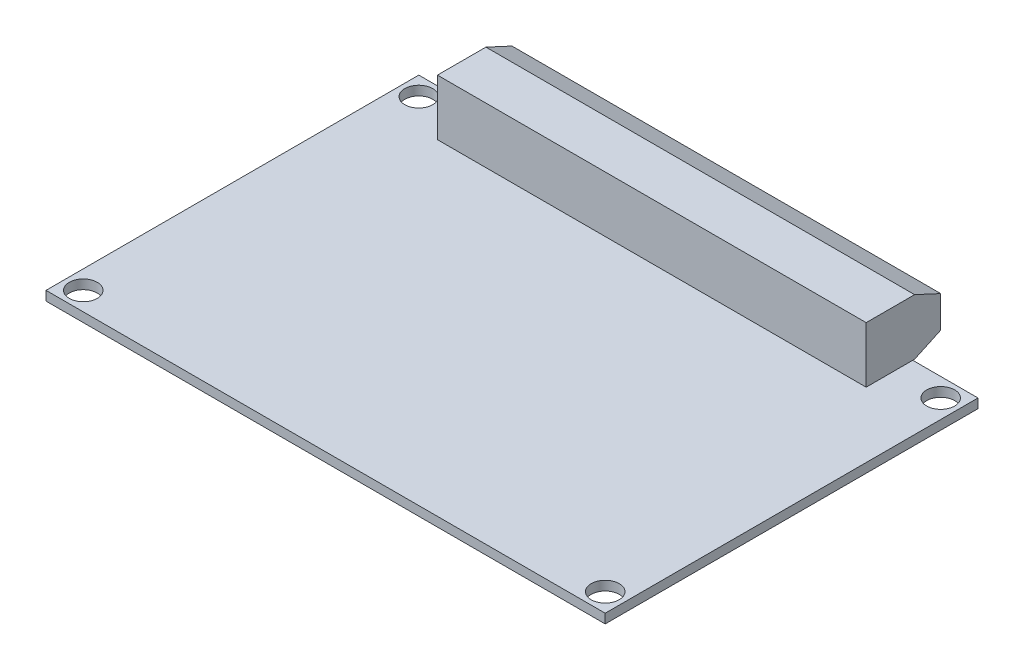
ISO-10303-21;
HEADER;
FILE_DESCRIPTION(('STEP AP214'),'2;1');
FILE_NAME('part.step','',(''),(''),'','','');
FILE_SCHEMA(('AUTOMOTIVE_DESIGN { 1 0 10303 214 1 1 1 1 }'));
ENDSEC;
DATA;
#1=APPLICATION_CONTEXT('core data for automotive mechanical design processes');
#2=APPLICATION_PROTOCOL_DEFINITION('international standard','automotive_design',2000,#1);
#3=PRODUCT_CONTEXT('',#1,'mechanical');
#4=PRODUCT('Part','Part','',(#3));
#5=PRODUCT_RELATED_PRODUCT_CATEGORY('part','',(#4));
#6=PRODUCT_DEFINITION_FORMATION('','',#4);
#7=PRODUCT_DEFINITION_CONTEXT('part definition',#1,'design');
#8=PRODUCT_DEFINITION('design','',#6,#7);
#9=PRODUCT_DEFINITION_SHAPE('','',#8);
#10=(LENGTH_UNIT() NAMED_UNIT(*) SI_UNIT(.MILLI.,.METRE.));
#11=(NAMED_UNIT(*) PLANE_ANGLE_UNIT() SI_UNIT($,.RADIAN.));
#12=(NAMED_UNIT(*) SI_UNIT($,.STERADIAN.) SOLID_ANGLE_UNIT());
#13=UNCERTAINTY_MEASURE_WITH_UNIT(LENGTH_MEASURE(1.E-05),#10,'distance_accuracy_value','');
#14=(GEOMETRIC_REPRESENTATION_CONTEXT(3) GLOBAL_UNCERTAINTY_ASSIGNED_CONTEXT((#13)) GLOBAL_UNIT_ASSIGNED_CONTEXT((#10,
#11,#12)) REPRESENTATION_CONTEXT('',''));
#15=CARTESIAN_POINT('',(0.,0.,0.));
#16=DIRECTION('',(0.,0.,1.));
#17=DIRECTION('',(1.,0.,0.));
#18=AXIS2_PLACEMENT_3D('',#15,#16,#17);
#19=CARTESIAN_POINT('',(0.,0.5,0.));
#20=DIRECTION('',(0.,-1.,0.));
#21=DIRECTION('',(0.,0.,-1.));
#22=AXIS2_PLACEMENT_3D('',#19,#20,#21);
#23=PLANE('',#22);
#24=CARTESIAN_POINT('',(-28.,0.500000000000007,-18.));
#25=DIRECTION('',(0.,1.,0.));
#26=DIRECTION('',(0.,0.,1.));
#27=AXIS2_PLACEMENT_3D('',#24,#25,#26);
#28=CIRCLE('',#27,1.5);
#29=CARTESIAN_POINT('',(-28.,0.500000000000007,-16.5));
#30=VERTEX_POINT('',#29);
#31=EDGE_CURVE('E149',#30,#30,#28,.T.);
#32=ORIENTED_EDGE('',*,*,#31,.F.);
#33=EDGE_LOOP('',(#32));
#34=FACE_BOUND('',#33,.T.);
#35=CARTESIAN_POINT('',(-28.,0.500000000000007,18.));
#36=DIRECTION('',(0.,1.,0.));
#37=DIRECTION('',(0.,0.,-1.));
#38=AXIS2_PLACEMENT_3D('',#35,#36,#37);
#39=CIRCLE('',#38,1.5);
#40=CARTESIAN_POINT('',(-28.,0.500000000000007,16.5));
#41=VERTEX_POINT('',#40);
#42=EDGE_CURVE('E145',#41,#41,#39,.T.);
#43=ORIENTED_EDGE('',*,*,#42,.F.);
#44=EDGE_LOOP('',(#43));
#45=FACE_BOUND('',#44,.T.);
#46=CARTESIAN_POINT('',(28.,0.5,17.9999999999999));
#47=DIRECTION('',(0.,1.,0.));
#48=DIRECTION('',(0.,0.,1.));
#49=AXIS2_PLACEMENT_3D('',#46,#47,#48);
#50=CIRCLE('',#49,1.5);
#51=CARTESIAN_POINT('',(28.,0.5,19.4999999999999));
#52=VERTEX_POINT('',#51);
#53=EDGE_CURVE('E156',#52,#52,#50,.T.);
#54=ORIENTED_EDGE('',*,*,#53,.F.);
#55=EDGE_LOOP('',(#54));
#56=FACE_BOUND('',#55,.T.);
#57=CARTESIAN_POINT('',(28.,0.5,-18.));
#58=DIRECTION('',(0.,1.,0.));
#59=DIRECTION('',(0.,0.,-1.));
#60=AXIS2_PLACEMENT_3D('',#57,#58,#59);
#61=CIRCLE('',#60,1.5);
#62=CARTESIAN_POINT('',(28.,0.5,-19.5));
#63=VERTEX_POINT('',#62);
#64=EDGE_CURVE('E150',#63,#63,#61,.T.);
#65=ORIENTED_EDGE('',*,*,#64,.F.);
#66=EDGE_LOOP('',(#65));
#67=FACE_BOUND('',#66,.T.);
#68=DIRECTION('',(0.,0.,1.));
#69=VECTOR('',#68,1.);
#70=CARTESIAN_POINT('',(-23.,0.5,-23.));
#71=LINE('',#70,#69);
#72=CARTESIAN_POINT('',(-23.,0.5,-20.));
#73=VERTEX_POINT('',#72);
#74=CARTESIAN_POINT('',(-23.,0.5,-15.));
#75=VERTEX_POINT('',#74);
#76=EDGE_CURVE('E201',#73,#75,#71,.T.);
#77=ORIENTED_EDGE('',*,*,#76,.F.);
#78=DIRECTION('',(-1.,0.,0.));
#79=VECTOR('',#78,1.);
#80=CARTESIAN_POINT('',(-30.,0.5,-20.));
#81=LINE('',#80,#79);
#82=CARTESIAN_POINT('',(-30.,0.5,-20.));
#83=VERTEX_POINT('',#82);
#84=EDGE_CURVE('E173',#73,#83,#81,.T.);
#85=ORIENTED_EDGE('',*,*,#84,.T.);
#86=DIRECTION('',(0.,0.,1.));
#87=VECTOR('',#86,1.);
#88=CARTESIAN_POINT('',(-30.,0.5,20.));
#89=LINE('',#88,#87);
#90=CARTESIAN_POINT('',(-30.,0.5,20.));
#91=VERTEX_POINT('',#90);
#92=EDGE_CURVE('E178',#83,#91,#89,.T.);
#93=ORIENTED_EDGE('',*,*,#92,.T.);
#94=DIRECTION('',(1.,0.,0.));
#95=VECTOR('',#94,1.);
#96=CARTESIAN_POINT('',(-30.,0.5,20.));
#97=LINE('',#96,#95);
#98=CARTESIAN_POINT('',(30.,0.499999999999994,19.9999999999999));
#99=VERTEX_POINT('',#98);
#100=EDGE_CURVE('E181',#91,#99,#97,.T.);
#101=ORIENTED_EDGE('',*,*,#100,.T.);
#102=DIRECTION('',(0.,0.,-1.));
#103=VECTOR('',#102,1.);
#104=CARTESIAN_POINT('',(30.,0.499999999999994,19.9999999999999));
#105=LINE('',#104,#103);
#106=CARTESIAN_POINT('',(30.,0.499999999999994,-20.));
#107=VERTEX_POINT('',#106);
#108=EDGE_CURVE('E170',#99,#107,#105,.T.);
#109=ORIENTED_EDGE('',*,*,#108,.T.);
#110=CARTESIAN_POINT('',(23.,0.5,-20.));
#111=VERTEX_POINT('',#110);
#112=EDGE_CURVE('E175',#107,#111,#81,.T.);
#113=ORIENTED_EDGE('',*,*,#112,.T.);
#114=DIRECTION('',(0.,0.,-1.));
#115=VECTOR('',#114,1.);
#116=CARTESIAN_POINT('',(23.,0.5,-23.));
#117=LINE('',#116,#115);
#118=CARTESIAN_POINT('',(23.,0.5,-15.));
#119=VERTEX_POINT('',#118);
#120=EDGE_CURVE('E222',#119,#111,#117,.T.);
#121=ORIENTED_EDGE('',*,*,#120,.F.);
#122=DIRECTION('',(1.,0.,0.));
#123=VECTOR('',#122,1.);
#124=CARTESIAN_POINT('',(-23.,0.5,-15.));
#125=LINE('',#124,#123);
#126=EDGE_CURVE('E210',#75,#119,#125,.T.);
#127=ORIENTED_EDGE('',*,*,#126,.F.);
#128=EDGE_LOOP('',(#77,#85,#93,#101,#109,#113,#121,#127));
#129=FACE_BOUND('',#128,.T.);
#130=ADVANCED_FACE('F32',(#34,#45,#56,#67,#129),#23,.F.);
#131=CARTESIAN_POINT('',(30.,0.499999999999994,19.9999999999999));
#132=DIRECTION('',(-1.,0.,0.));
#133=DIRECTION('',(0.,0.,1.));
#134=AXIS2_PLACEMENT_3D('',#131,#132,#133);
#135=PLANE('',#134);
#136=DIRECTION('',(0.,0.,-1.));
#137=VECTOR('',#136,1.);
#138=CARTESIAN_POINT('',(30.,-0.5,19.9999999999999));
#139=LINE('',#138,#137);
#140=CARTESIAN_POINT('',(30.,-0.5,19.9999999999999));
#141=VERTEX_POINT('',#140);
#142=CARTESIAN_POINT('',(30.,-0.5,-20.));
#143=VERTEX_POINT('',#142);
#144=EDGE_CURVE('E167',#141,#143,#139,.T.);
#145=ORIENTED_EDGE('',*,*,#144,.T.);
#146=DIRECTION('',(0.,-1.,0.));
#147=VECTOR('',#146,1.);
#148=CARTESIAN_POINT('',(30.,0.499999999999994,-20.));
#149=LINE('',#148,#147);
#150=EDGE_CURVE('E199',#107,#143,#149,.T.);
#151=ORIENTED_EDGE('',*,*,#150,.F.);
#152=ORIENTED_EDGE('',*,*,#108,.F.);
#153=DIRECTION('',(0.,-1.,0.));
#154=VECTOR('',#153,1.);
#155=CARTESIAN_POINT('',(30.,0.499999999999994,19.9999999999999));
#156=LINE('',#155,#154);
#157=EDGE_CURVE('E183',#99,#141,#156,.T.);
#158=ORIENTED_EDGE('',*,*,#157,.T.);
#159=EDGE_LOOP('',(#145,#151,#152,#158));
#160=FACE_BOUND('',#159,.T.);
#161=ADVANCED_FACE('F34',(#160),#135,.F.);
#162=CARTESIAN_POINT('',(-30.,0.5,-20.));
#163=DIRECTION('',(0.,0.,1.));
#164=DIRECTION('',(1.,0.,0.));
#165=AXIS2_PLACEMENT_3D('',#162,#163,#164);
#166=PLANE('',#165);
#167=DIRECTION('',(-1.,0.,0.));
#168=VECTOR('',#167,1.);
#169=CARTESIAN_POINT('',(-30.,-0.499999999999994,-20.));
#170=LINE('',#169,#168);
#171=CARTESIAN_POINT('',(-30.,-0.499999999999994,-20.));
#172=VERTEX_POINT('',#171);
#173=EDGE_CURVE('E186',#143,#172,#170,.T.);
#174=ORIENTED_EDGE('',*,*,#173,.T.);
#175=DIRECTION('',(0.,-1.,0.));
#176=VECTOR('',#175,1.);
#177=CARTESIAN_POINT('',(-30.,0.5,-20.));
#178=LINE('',#177,#176);
#179=EDGE_CURVE('E196',#83,#172,#178,.T.);
#180=ORIENTED_EDGE('',*,*,#179,.F.);
#181=ORIENTED_EDGE('',*,*,#84,.F.);
#182=EDGE_CURVE('E179',#111,#73,#81,.T.);
#183=ORIENTED_EDGE('',*,*,#182,.F.);
#184=ORIENTED_EDGE('',*,*,#112,.F.);
#185=ORIENTED_EDGE('',*,*,#150,.T.);
#186=EDGE_LOOP('',(#174,#180,#181,#183,#184,#185));
#187=FACE_BOUND('',#186,.T.);
#188=ADVANCED_FACE('F253',(#187),#166,.F.);
#189=CARTESIAN_POINT('',(-30.,0.5,20.));
#190=DIRECTION('',(1.,0.,0.));
#191=DIRECTION('',(0.,0.,-1.));
#192=AXIS2_PLACEMENT_3D('',#189,#190,#191);
#193=PLANE('',#192);
#194=DIRECTION('',(0.,0.,1.));
#195=VECTOR('',#194,1.);
#196=CARTESIAN_POINT('',(-30.,-0.499999999999994,20.));
#197=LINE('',#196,#195);
#198=CARTESIAN_POINT('',(-30.,-0.499999999999994,20.));
#199=VERTEX_POINT('',#198);
#200=EDGE_CURVE('E188',#172,#199,#197,.T.);
#201=ORIENTED_EDGE('',*,*,#200,.T.);
#202=DIRECTION('',(0.,-1.,0.));
#203=VECTOR('',#202,1.);
#204=CARTESIAN_POINT('',(-30.,0.5,20.));
#205=LINE('',#204,#203);
#206=EDGE_CURVE('E193',#91,#199,#205,.T.);
#207=ORIENTED_EDGE('',*,*,#206,.F.);
#208=ORIENTED_EDGE('',*,*,#92,.F.);
#209=ORIENTED_EDGE('',*,*,#179,.T.);
#210=EDGE_LOOP('',(#201,#207,#208,#209));
#211=FACE_BOUND('',#210,.T.);
#212=ADVANCED_FACE('F268',(#211),#193,.F.);
#213=CARTESIAN_POINT('',(-30.,0.5,20.));
#214=DIRECTION('',(0.,0.,-1.));
#215=DIRECTION('',(-1.,0.,0.));
#216=AXIS2_PLACEMENT_3D('',#213,#214,#215);
#217=PLANE('',#216);
#218=DIRECTION('',(1.,0.,0.));
#219=VECTOR('',#218,1.);
#220=CARTESIAN_POINT('',(-30.,-0.499999999999994,20.));
#221=LINE('',#220,#219);
#222=EDGE_CURVE('E174',#199,#141,#221,.T.);
#223=ORIENTED_EDGE('',*,*,#222,.T.);
#224=ORIENTED_EDGE('',*,*,#157,.F.);
#225=ORIENTED_EDGE('',*,*,#100,.F.);
#226=ORIENTED_EDGE('',*,*,#206,.T.);
#227=EDGE_LOOP('',(#223,#224,#225,#226));
#228=FACE_BOUND('',#227,.T.);
#229=ADVANCED_FACE('F264',(#228),#217,.F.);
#230=CARTESIAN_POINT('',(0.,-0.5,0.));
#231=DIRECTION('',(0.,-1.,0.));
#232=DIRECTION('',(0.,0.,-1.));
#233=AXIS2_PLACEMENT_3D('',#230,#231,#232);
#234=PLANE('',#233);
#235=CARTESIAN_POINT('',(28.,-0.499999999999987,-18.));
#236=DIRECTION('',(0.,1.,0.));
#237=DIRECTION('',(0.,0.,-1.));
#238=AXIS2_PLACEMENT_3D('',#235,#236,#237);
#239=CIRCLE('',#238,1.5);
#240=CARTESIAN_POINT('',(28.,-0.499999999999987,-19.5));
#241=VERTEX_POINT('',#240);
#242=EDGE_CURVE('E146',#241,#241,#239,.T.);
#243=ORIENTED_EDGE('',*,*,#242,.T.);
#244=EDGE_LOOP('',(#243));
#245=FACE_BOUND('',#244,.T.);
#246=CARTESIAN_POINT('',(28.,-0.499999999999987,17.9999999999999));
#247=DIRECTION('',(0.,1.,0.));
#248=DIRECTION('',(0.,0.,1.));
#249=AXIS2_PLACEMENT_3D('',#246,#247,#248);
#250=CIRCLE('',#249,1.5);
#251=CARTESIAN_POINT('',(28.,-0.499999999999987,19.4999999999999));
#252=VERTEX_POINT('',#251);
#253=EDGE_CURVE('E153',#252,#252,#250,.T.);
#254=ORIENTED_EDGE('',*,*,#253,.T.);
#255=EDGE_LOOP('',(#254));
#256=FACE_BOUND('',#255,.T.);
#257=CARTESIAN_POINT('',(-28.,-0.499999999999994,18.));
#258=DIRECTION('',(0.,1.,0.));
#259=DIRECTION('',(0.,0.,-1.));
#260=AXIS2_PLACEMENT_3D('',#257,#258,#259);
#261=CIRCLE('',#260,1.5);
#262=CARTESIAN_POINT('',(-28.,-0.499999999999994,16.5));
#263=VERTEX_POINT('',#262);
#264=EDGE_CURVE('E159',#263,#263,#261,.T.);
#265=ORIENTED_EDGE('',*,*,#264,.T.);
#266=EDGE_LOOP('',(#265));
#267=FACE_BOUND('',#266,.T.);
#268=CARTESIAN_POINT('',(-28.,-0.499999999999994,-18.));
#269=DIRECTION('',(0.,1.,0.));
#270=DIRECTION('',(0.,0.,1.));
#271=AXIS2_PLACEMENT_3D('',#268,#269,#270);
#272=CIRCLE('',#271,1.5);
#273=CARTESIAN_POINT('',(-28.,-0.499999999999994,-16.5));
#274=VERTEX_POINT('',#273);
#275=EDGE_CURVE('E164',#274,#274,#272,.T.);
#276=ORIENTED_EDGE('',*,*,#275,.T.);
#277=EDGE_LOOP('',(#276));
#278=FACE_BOUND('',#277,.T.);
#279=ORIENTED_EDGE('',*,*,#144,.F.);
#280=ORIENTED_EDGE('',*,*,#222,.F.);
#281=ORIENTED_EDGE('',*,*,#200,.F.);
#282=ORIENTED_EDGE('',*,*,#173,.F.);
#283=EDGE_LOOP('',(#279,#280,#281,#282));
#284=FACE_BOUND('',#283,.T.);
#285=ADVANCED_FACE('F261',(#245,#256,#267,#278,#284),#234,.T.);
#286=CARTESIAN_POINT('',(-28.,-0.499999999999994,-18.));
#287=DIRECTION('',(0.,1.,0.));
#288=DIRECTION('',(0.,0.,1.));
#289=AXIS2_PLACEMENT_3D('',#286,#287,#288);
#290=CYLINDRICAL_SURFACE('',#289,1.5);
#291=ORIENTED_EDGE('',*,*,#275,.F.);
#292=EDGE_LOOP('',(#291));
#293=FACE_BOUND('',#292,.T.);
#294=ORIENTED_EDGE('',*,*,#31,.T.);
#295=EDGE_LOOP('',(#294));
#296=FACE_BOUND('',#295,.T.);
#297=ADVANCED_FACE('F259',(#293,#296),#290,.F.);
#298=CARTESIAN_POINT('',(-28.,-0.499999999999994,18.));
#299=DIRECTION('',(0.,1.,0.));
#300=DIRECTION('',(0.,0.,1.));
#301=AXIS2_PLACEMENT_3D('',#298,#299,#300);
#302=CYLINDRICAL_SURFACE('',#301,1.5);
#303=ORIENTED_EDGE('',*,*,#264,.F.);
#304=EDGE_LOOP('',(#303));
#305=FACE_BOUND('',#304,.T.);
#306=ORIENTED_EDGE('',*,*,#42,.T.);
#307=EDGE_LOOP('',(#306));
#308=FACE_BOUND('',#307,.T.);
#309=ADVANCED_FACE('F309',(#305,#308),#302,.F.);
#310=CARTESIAN_POINT('',(28.,-0.499999999999987,17.9999999999999));
#311=DIRECTION('',(0.,1.,0.));
#312=DIRECTION('',(0.,0.,1.));
#313=AXIS2_PLACEMENT_3D('',#310,#311,#312);
#314=CYLINDRICAL_SURFACE('',#313,1.5);
#315=ORIENTED_EDGE('',*,*,#253,.F.);
#316=EDGE_LOOP('',(#315));
#317=FACE_BOUND('',#316,.T.);
#318=ORIENTED_EDGE('',*,*,#53,.T.);
#319=EDGE_LOOP('',(#318));
#320=FACE_BOUND('',#319,.T.);
#321=ADVANCED_FACE('F316',(#317,#320),#314,.F.);
#322=CARTESIAN_POINT('',(28.,-0.499999999999987,-18.));
#323=DIRECTION('',(0.,1.,0.));
#324=DIRECTION('',(0.,0.,1.));
#325=AXIS2_PLACEMENT_3D('',#322,#323,#324);
#326=CYLINDRICAL_SURFACE('',#325,1.5);
#327=ORIENTED_EDGE('',*,*,#242,.F.);
#328=EDGE_LOOP('',(#327));
#329=FACE_BOUND('',#328,.T.);
#330=ORIENTED_EDGE('',*,*,#64,.T.);
#331=EDGE_LOOP('',(#330));
#332=FACE_BOUND('',#331,.T.);
#333=ADVANCED_FACE('F244',(#329,#332),#326,.F.);
#334=CARTESIAN_POINT('',(0.,0.5,0.));
#335=DIRECTION('',(0.,1.,0.));
#336=DIRECTION('',(0.,0.,1.));
#337=AXIS2_PLACEMENT_3D('',#334,#335,#336);
#338=PLANE('',#337);
#339=CARTESIAN_POINT('',(-23.,0.5,-20.2));
#340=VERTEX_POINT('',#339);
#341=EDGE_CURVE('E204',#340,#73,#71,.T.);
#342=ORIENTED_EDGE('',*,*,#341,.F.);
#343=DIRECTION('',(1.,0.,0.));
#344=VECTOR('',#343,1.);
#345=CARTESIAN_POINT('',(-30.0000000000001,0.5,-20.2));
#346=LINE('',#345,#344);
#347=CARTESIAN_POINT('',(23.,0.5,-20.2));
#348=VERTEX_POINT('',#347);
#349=EDGE_CURVE('E128',#340,#348,#346,.T.);
#350=ORIENTED_EDGE('',*,*,#349,.T.);
#351=EDGE_CURVE('E127',#111,#348,#117,.T.);
#352=ORIENTED_EDGE('',*,*,#351,.F.);
#353=ORIENTED_EDGE('',*,*,#182,.T.);
#354=EDGE_LOOP('',(#342,#350,#352,#353));
#355=FACE_BOUND('',#354,.T.);
#356=ADVANCED_FACE('F232',(#355),#338,.F.);
#357=CARTESIAN_POINT('',(-23.,6.5,-23.));
#358=DIRECTION('',(1.,0.,0.));
#359=DIRECTION('',(0.,0.,-1.));
#360=AXIS2_PLACEMENT_3D('',#357,#358,#359);
#361=PLANE('',#360);
#362=DIRECTION('',(0.,-1.,0.));
#363=VECTOR('',#362,1.);
#364=CARTESIAN_POINT('',(-23.,6.5,-23.));
#365=LINE('',#364,#363);
#366=CARTESIAN_POINT('',(-23.,5.2,-23.));
#367=VERTEX_POINT('',#366);
#368=CARTESIAN_POINT('',(-23.,1.8,-23.));
#369=VERTEX_POINT('',#368);
#370=EDGE_CURVE('E134',#367,#369,#365,.T.);
#371=ORIENTED_EDGE('',*,*,#370,.T.);
#372=DIRECTION('',(0.,-0.421111306454629,0.907008967748432));
#373=VECTOR('',#372,1.);
#374=CARTESIAN_POINT('',(-23.,2.63347324239245,-24.7951731374607));
#375=LINE('',#374,#373);
#376=EDGE_CURVE('E47',#369,#340,#375,.T.);
#377=ORIENTED_EDGE('',*,*,#376,.T.);
#378=ORIENTED_EDGE('',*,*,#341,.T.);
#379=ORIENTED_EDGE('',*,*,#76,.T.);
#380=DIRECTION('',(0.,-1.,0.));
#381=VECTOR('',#380,1.);
#382=CARTESIAN_POINT('',(-23.,6.5,-15.));
#383=LINE('',#382,#381);
#384=CARTESIAN_POINT('',(-23.,6.5,-15.));
#385=VERTEX_POINT('',#384);
#386=EDGE_CURVE('E137',#385,#75,#383,.T.);
#387=ORIENTED_EDGE('',*,*,#386,.F.);
#388=DIRECTION('',(0.,0.,1.));
#389=VECTOR('',#388,1.);
#390=CARTESIAN_POINT('',(-23.,6.5,-23.));
#391=LINE('',#390,#389);
#392=CARTESIAN_POINT('',(-23.,6.5,-20.2));
#393=VERTEX_POINT('',#392);
#394=EDGE_CURVE('E219',#393,#385,#391,.T.);
#395=ORIENTED_EDGE('',*,*,#394,.F.);
#396=DIRECTION('',(0.,-0.421111306454629,-0.907008967748432));
#397=VECTOR('',#396,1.);
#398=CARTESIAN_POINT('',(-23.,5.43053515215109,-22.503462749213));
#399=LINE('',#398,#397);
#400=EDGE_CURVE('E54',#393,#367,#399,.T.);
#401=ORIENTED_EDGE('',*,*,#400,.T.);
#402=EDGE_LOOP('',(#371,#377,#378,#379,#387,#395,#401));
#403=FACE_BOUND('',#402,.T.);
#404=ADVANCED_FACE('F234',(#403),#361,.F.);
#405=CARTESIAN_POINT('',(-23.,6.5,-15.));
#406=DIRECTION('',(0.,0.,-1.));
#407=DIRECTION('',(-1.,0.,0.));
#408=AXIS2_PLACEMENT_3D('',#405,#406,#407);
#409=PLANE('',#408);
#410=ORIENTED_EDGE('',*,*,#126,.T.);
#411=DIRECTION('',(0.,-1.,0.));
#412=VECTOR('',#411,1.);
#413=CARTESIAN_POINT('',(23.,6.50000000000001,-15.));
#414=LINE('',#413,#412);
#415=CARTESIAN_POINT('',(23.,6.50000000000001,-15.));
#416=VERTEX_POINT('',#415);
#417=EDGE_CURVE('E133',#416,#119,#414,.T.);
#418=ORIENTED_EDGE('',*,*,#417,.F.);
#419=DIRECTION('',(1.,0.,0.));
#420=VECTOR('',#419,1.);
#421=CARTESIAN_POINT('',(-23.,6.5,-15.));
#422=LINE('',#421,#420);
#423=EDGE_CURVE('E221',#385,#416,#422,.T.);
#424=ORIENTED_EDGE('',*,*,#423,.F.);
#425=ORIENTED_EDGE('',*,*,#386,.T.);
#426=EDGE_LOOP('',(#410,#418,#424,#425));
#427=FACE_BOUND('',#426,.T.);
#428=ADVANCED_FACE('F236',(#427),#409,.F.);
#429=CARTESIAN_POINT('',(23.,6.50000000000001,-23.));
#430=DIRECTION('',(-1.,0.,0.));
#431=DIRECTION('',(0.,0.,1.));
#432=AXIS2_PLACEMENT_3D('',#429,#430,#431);
#433=PLANE('',#432);
#434=ORIENTED_EDGE('',*,*,#351,.T.);
#435=DIRECTION('',(0.,-0.421111306454629,0.907008967748432));
#436=VECTOR('',#435,1.);
#437=CARTESIAN_POINT('',(23.,0.5,-20.2));
#438=LINE('',#437,#436);
#439=CARTESIAN_POINT('',(23.,1.8,-23.));
#440=VERTEX_POINT('',#439);
#441=EDGE_CURVE('E113',#440,#348,#438,.T.);
#442=ORIENTED_EDGE('',*,*,#441,.F.);
#443=DIRECTION('',(0.,-1.,0.));
#444=VECTOR('',#443,1.);
#445=CARTESIAN_POINT('',(23.,6.50000000000001,-23.));
#446=LINE('',#445,#444);
#447=CARTESIAN_POINT('',(23.,5.2,-23.));
#448=VERTEX_POINT('',#447);
#449=EDGE_CURVE('E124',#448,#440,#446,.T.);
#450=ORIENTED_EDGE('',*,*,#449,.F.);
#451=DIRECTION('',(0.,-0.421111306454629,-0.907008967748432));
#452=VECTOR('',#451,1.);
#453=CARTESIAN_POINT('',(23.,6.50000000000001,-20.2));
#454=LINE('',#453,#452);
#455=CARTESIAN_POINT('',(23.,6.50000000000001,-20.2));
#456=VERTEX_POINT('',#455);
#457=EDGE_CURVE('E215',#456,#448,#454,.T.);
#458=ORIENTED_EDGE('',*,*,#457,.F.);
#459=DIRECTION('',(0.,0.,-1.));
#460=VECTOR('',#459,1.);
#461=CARTESIAN_POINT('',(23.,6.50000000000001,-23.));
#462=LINE('',#461,#460);
#463=EDGE_CURVE('E139',#416,#456,#462,.T.);
#464=ORIENTED_EDGE('',*,*,#463,.F.);
#465=ORIENTED_EDGE('',*,*,#417,.T.);
#466=ORIENTED_EDGE('',*,*,#120,.T.);
#467=EDGE_LOOP('',(#434,#442,#450,#458,#464,#465,#466));
#468=FACE_BOUND('',#467,.T.);
#469=ADVANCED_FACE('F122',(#468),#433,.F.);
#470=CARTESIAN_POINT('',(-23.,6.5,-23.));
#471=DIRECTION('',(0.,0.,1.));
#472=DIRECTION('',(1.,0.,0.));
#473=AXIS2_PLACEMENT_3D('',#470,#471,#472);
#474=PLANE('',#473);
#475=ORIENTED_EDGE('',*,*,#449,.T.);
#476=DIRECTION('',(-1.,0.,0.));
#477=VECTOR('',#476,1.);
#478=CARTESIAN_POINT('',(-23.,1.80000000000001,-23.));
#479=LINE('',#478,#477);
#480=EDGE_CURVE('E11',#440,#369,#479,.T.);
#481=ORIENTED_EDGE('',*,*,#480,.T.);
#482=ORIENTED_EDGE('',*,*,#370,.F.);
#483=DIRECTION('',(1.,0.,0.));
#484=VECTOR('',#483,1.);
#485=CARTESIAN_POINT('',(-30.,5.2,-23.));
#486=LINE('',#485,#484);
#487=EDGE_CURVE('E132',#367,#448,#486,.T.);
#488=ORIENTED_EDGE('',*,*,#487,.T.);
#489=EDGE_LOOP('',(#475,#481,#482,#488));
#490=FACE_BOUND('',#489,.T.);
#491=ADVANCED_FACE('F131',(#490),#474,.F.);
#492=CARTESIAN_POINT('',(0.,6.5,0.));
#493=DIRECTION('',(0.,1.,0.));
#494=DIRECTION('',(0.,0.,1.));
#495=AXIS2_PLACEMENT_3D('',#492,#493,#494);
#496=PLANE('',#495);
#497=DIRECTION('',(1.,0.,0.));
#498=VECTOR('',#497,1.);
#499=CARTESIAN_POINT('',(0.,6.5,-20.2));
#500=LINE('',#499,#498);
#501=EDGE_CURVE('E40',#393,#456,#500,.T.);
#502=ORIENTED_EDGE('',*,*,#501,.F.);
#503=ORIENTED_EDGE('',*,*,#394,.T.);
#504=ORIENTED_EDGE('',*,*,#423,.T.);
#505=ORIENTED_EDGE('',*,*,#463,.T.);
#506=EDGE_LOOP('',(#502,#503,#504,#505));
#507=FACE_BOUND('',#506,.T.);
#508=ADVANCED_FACE('F226',(#507),#496,.T.);
#509=CARTESIAN_POINT('',(-30.0000000000001,6.50000000000001,-20.2));
#510=DIRECTION('',(0.,-0.907008967748432,0.421111306454629));
#511=DIRECTION('',(0.,-0.421111306454629,-0.907008967748432));
#512=AXIS2_PLACEMENT_3D('',#509,#510,#511);
#513=PLANE('',#512);
#514=ORIENTED_EDGE('',*,*,#501,.T.);
#515=ORIENTED_EDGE('',*,*,#457,.T.);
#516=ORIENTED_EDGE('',*,*,#487,.F.);
#517=ORIENTED_EDGE('',*,*,#400,.F.);
#518=EDGE_LOOP('',(#514,#515,#516,#517));
#519=FACE_BOUND('',#518,.T.);
#520=ADVANCED_FACE('F370',(#519),#513,.F.);
#521=CARTESIAN_POINT('',(-30.0000000000001,0.5,-20.2));
#522=DIRECTION('',(0.,0.907008967748432,0.421111306454629));
#523=DIRECTION('',(0.,-0.421111306454629,0.907008967748432));
#524=AXIS2_PLACEMENT_3D('',#521,#522,#523);
#525=PLANE('',#524);
#526=ORIENTED_EDGE('',*,*,#480,.F.);
#527=ORIENTED_EDGE('',*,*,#441,.T.);
#528=ORIENTED_EDGE('',*,*,#349,.F.);
#529=ORIENTED_EDGE('',*,*,#376,.F.);
#530=EDGE_LOOP('',(#526,#527,#528,#529));
#531=FACE_BOUND('',#530,.T.);
#532=ADVANCED_FACE('F112',(#531),#525,.F.);
#533=CLOSED_SHELL('',(#130,#161,#188,#212,#229,#285,#297,#309,#321,#333,#356,#404,#428,#469,
#491,#508,#520,#532));
#534=MANIFOLD_SOLID_BREP('B2',#533);
#535=ADVANCED_BREP_SHAPE_REPRESENTATION('',(#18,#534),#14);
#536=SHAPE_DEFINITION_REPRESENTATION(#9,#535);
ENDSEC;
END-ISO-10303-21;
